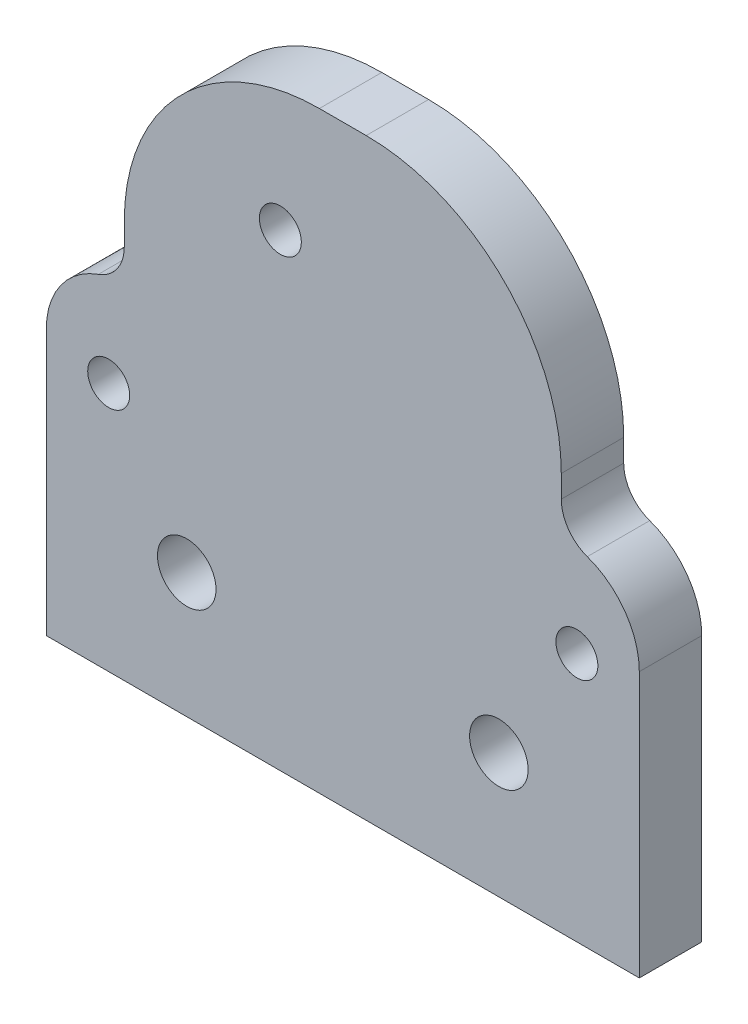
ISO-10303-21;
HEADER;
FILE_DESCRIPTION(('STEP AP214'),'2;1');
FILE_NAME('part.step','',(''),(''),'','','');
FILE_SCHEMA(('AUTOMOTIVE_DESIGN { 1 0 10303 214 1 1 1 1 }'));
ENDSEC;
DATA;
#1=APPLICATION_CONTEXT('core data for automotive mechanical design processes');
#2=APPLICATION_PROTOCOL_DEFINITION('international standard','automotive_design',2000,#1);
#3=PRODUCT_CONTEXT('',#1,'mechanical');
#4=PRODUCT('Part','Part','',(#3));
#5=PRODUCT_RELATED_PRODUCT_CATEGORY('part','',(#4));
#6=PRODUCT_DEFINITION_FORMATION('','',#4);
#7=PRODUCT_DEFINITION_CONTEXT('part definition',#1,'design');
#8=PRODUCT_DEFINITION('design','',#6,#7);
#9=PRODUCT_DEFINITION_SHAPE('','',#8);
#10=(LENGTH_UNIT() NAMED_UNIT(*) SI_UNIT(.MILLI.,.METRE.));
#11=(NAMED_UNIT(*) PLANE_ANGLE_UNIT() SI_UNIT($,.RADIAN.));
#12=(NAMED_UNIT(*) SI_UNIT($,.STERADIAN.) SOLID_ANGLE_UNIT());
#13=UNCERTAINTY_MEASURE_WITH_UNIT(LENGTH_MEASURE(1.E-05),#10,'distance_accuracy_value','');
#14=(GEOMETRIC_REPRESENTATION_CONTEXT(3) GLOBAL_UNCERTAINTY_ASSIGNED_CONTEXT((#13)) GLOBAL_UNIT_ASSIGNED_CONTEXT((#10,
#11,#12)) REPRESENTATION_CONTEXT('',''));
#15=CARTESIAN_POINT('',(0.,0.,0.));
#16=DIRECTION('',(0.,0.,1.));
#17=DIRECTION('',(1.,0.,0.));
#18=AXIS2_PLACEMENT_3D('',#15,#16,#17);
#19=CARTESIAN_POINT('',(0.,17.6,0.));
#20=DIRECTION('',(1.,0.,0.));
#21=DIRECTION('',(0.,0.,-1.));
#22=AXIS2_PLACEMENT_3D('',#19,#20,#21);
#23=PLANE('',#22);
#24=DIRECTION('',(0.,-1.,0.));
#25=VECTOR('',#24,1.);
#26=CARTESIAN_POINT('',(0.,17.6,3.2));
#27=LINE('',#26,#25);
#28=CARTESIAN_POINT('',(0.,13.6,3.2));
#29=VERTEX_POINT('',#28);
#30=CARTESIAN_POINT('',(0.,0.,3.2));
#31=VERTEX_POINT('',#30);
#32=EDGE_CURVE('E120',#29,#31,#27,.T.);
#33=ORIENTED_EDGE('',*,*,#32,.F.);
#34=DIRECTION('',(0.,0.,1.));
#35=VECTOR('',#34,1.);
#36=CARTESIAN_POINT('',(0.,13.6,0.));
#37=LINE('',#36,#35);
#38=CARTESIAN_POINT('',(0.,13.6,0.));
#39=VERTEX_POINT('',#38);
#40=EDGE_CURVE('E195',#29,#39,#37,.F.);
#41=ORIENTED_EDGE('',*,*,#40,.T.);
#42=DIRECTION('',(0.,-1.,0.));
#43=VECTOR('',#42,1.);
#44=CARTESIAN_POINT('',(0.,17.6,0.));
#45=LINE('',#44,#43);
#46=CARTESIAN_POINT('',(0.,0.,0.));
#47=VERTEX_POINT('',#46);
#48=EDGE_CURVE('E142',#39,#47,#45,.T.);
#49=ORIENTED_EDGE('',*,*,#48,.T.);
#50=DIRECTION('',(0.,0.,1.));
#51=VECTOR('',#50,1.);
#52=CARTESIAN_POINT('',(0.,0.,0.));
#53=LINE('',#52,#51);
#54=EDGE_CURVE('E137',#47,#31,#53,.T.);
#55=ORIENTED_EDGE('',*,*,#54,.T.);
#56=EDGE_LOOP('',(#33,#41,#49,#55));
#57=FACE_BOUND('',#56,.T.);
#58=ADVANCED_FACE('F33',(#57),#23,.F.);
#59=CARTESIAN_POINT('',(0.,17.6,3.2));
#60=DIRECTION('',(0.,0.,-1.));
#61=DIRECTION('',(-1.,0.,0.));
#62=AXIS2_PLACEMENT_3D('',#59,#60,#61);
#63=PLANE('',#62);
#64=CARTESIAN_POINT('',(12.,24.,3.2));
#65=DIRECTION('',(0.,0.,1.));
#66=DIRECTION('',(1.,0.,0.));
#67=AXIS2_PLACEMENT_3D('',#64,#65,#66);
#68=CIRCLE('',#67,1.075);
#69=CARTESIAN_POINT('',(13.075,24.,3.2));
#70=VERTEX_POINT('',#69);
#71=EDGE_CURVE('E167',#70,#70,#68,.T.);
#72=ORIENTED_EDGE('',*,*,#71,.F.);
#73=EDGE_LOOP('',(#72));
#74=FACE_BOUND('',#73,.T.);
#75=CARTESIAN_POINT('',(3.2,12.8,3.2));
#76=DIRECTION('',(0.,0.,-1.));
#77=DIRECTION('',(-1.,0.,0.));
#78=AXIS2_PLACEMENT_3D('',#75,#76,#77);
#79=CIRCLE('',#78,1.075);
#80=CARTESIAN_POINT('',(2.125,12.8,3.2));
#81=VERTEX_POINT('',#80);
#82=EDGE_CURVE('E259',#81,#81,#79,.T.);
#83=ORIENTED_EDGE('',*,*,#82,.T.);
#84=EDGE_LOOP('',(#83));
#85=FACE_BOUND('',#84,.T.);
#86=CARTESIAN_POINT('',(27.2,12.8,3.2));
#87=DIRECTION('',(0.,0.,-1.));
#88=DIRECTION('',(-1.,0.,0.));
#89=AXIS2_PLACEMENT_3D('',#86,#87,#88);
#90=CIRCLE('',#89,1.075);
#91=CARTESIAN_POINT('',(26.125,12.8,3.2));
#92=VERTEX_POINT('',#91);
#93=EDGE_CURVE('E265',#92,#92,#90,.T.);
#94=ORIENTED_EDGE('',*,*,#93,.T.);
#95=EDGE_LOOP('',(#94));
#96=FACE_BOUND('',#95,.T.);
#97=CARTESIAN_POINT('',(7.2,6.4,3.2));
#98=DIRECTION('',(0.,0.,1.));
#99=DIRECTION('',(1.,0.,0.));
#100=AXIS2_PLACEMENT_3D('',#97,#98,#99);
#101=CIRCLE('',#100,1.5);
#102=CARTESIAN_POINT('',(8.70000000000001,6.4,3.2));
#103=VERTEX_POINT('',#102);
#104=EDGE_CURVE('E162',#103,#103,#101,.T.);
#105=ORIENTED_EDGE('',*,*,#104,.F.);
#106=EDGE_LOOP('',(#105));
#107=FACE_BOUND('',#106,.T.);
#108=CARTESIAN_POINT('',(23.2,6.4,3.2));
#109=DIRECTION('',(0.,0.,1.));
#110=DIRECTION('',(1.,0.,0.));
#111=AXIS2_PLACEMENT_3D('',#108,#109,#110);
#112=CIRCLE('',#111,1.5);
#113=CARTESIAN_POINT('',(24.7,6.4,3.2));
#114=VERTEX_POINT('',#113);
#115=EDGE_CURVE('E147',#114,#114,#112,.T.);
#116=ORIENTED_EDGE('',*,*,#115,.F.);
#117=EDGE_LOOP('',(#116));
#118=FACE_BOUND('',#117,.T.);
#119=DIRECTION('',(0.,-1.,0.));
#120=VECTOR('',#119,1.);
#121=CARTESIAN_POINT('',(30.4,17.6,3.2));
#122=LINE('',#121,#120);
#123=CARTESIAN_POINT('',(30.4,13.6,3.2));
#124=VERTEX_POINT('',#123);
#125=CARTESIAN_POINT('',(30.4,0.,3.2));
#126=VERTEX_POINT('',#125);
#127=EDGE_CURVE('E131',#124,#126,#122,.T.);
#128=ORIENTED_EDGE('',*,*,#127,.F.);
#129=CARTESIAN_POINT('',(26.4,13.6,3.2));
#130=DIRECTION('',(0.,0.,-1.));
#131=DIRECTION('',(-1.,0.,0.));
#132=AXIS2_PLACEMENT_3D('',#129,#130,#131);
#133=CIRCLE('',#132,4.);
#134=CARTESIAN_POINT('',(27.7333333333333,17.3712361663283,3.2));
#135=VERTEX_POINT('',#134);
#136=EDGE_CURVE('E192',#124,#135,#133,.F.);
#137=ORIENTED_EDGE('',*,*,#136,.T.);
#138=CARTESIAN_POINT('',(28.4,19.2568542494924,3.2));
#139=DIRECTION('',(0.,0.,-1.));
#140=DIRECTION('',(-1.,0.,0.));
#141=AXIS2_PLACEMENT_3D('',#138,#139,#140);
#142=CIRCLE('',#141,2.);
#143=CARTESIAN_POINT('',(26.4,19.2568542494924,3.2));
#144=VERTEX_POINT('',#143);
#145=EDGE_CURVE('E208',#135,#144,#142,.T.);
#146=ORIENTED_EDGE('',*,*,#145,.T.);
#147=DIRECTION('',(0.,-1.,0.));
#148=VECTOR('',#147,1.);
#149=CARTESIAN_POINT('',(26.4,30.4,3.2));
#150=LINE('',#149,#148);
#151=CARTESIAN_POINT('',(26.4,20.4,3.2));
#152=VERTEX_POINT('',#151);
#153=EDGE_CURVE('E212',#152,#144,#150,.T.);
#154=ORIENTED_EDGE('',*,*,#153,.F.);
#155=CARTESIAN_POINT('',(16.4,20.4,3.2));
#156=DIRECTION('',(0.,0.,-1.));
#157=DIRECTION('',(-1.,0.,0.));
#158=AXIS2_PLACEMENT_3D('',#155,#156,#157);
#159=CIRCLE('',#158,10.);
#160=CARTESIAN_POINT('',(16.4,30.4,3.2));
#161=VERTEX_POINT('',#160);
#162=EDGE_CURVE('E173',#152,#161,#159,.F.);
#163=ORIENTED_EDGE('',*,*,#162,.T.);
#164=DIRECTION('',(1.,0.,0.));
#165=VECTOR('',#164,1.);
#166=CARTESIAN_POINT('',(4.,30.4,3.2));
#167=LINE('',#166,#165);
#168=CARTESIAN_POINT('',(14.,30.4,3.2));
#169=VERTEX_POINT('',#168);
#170=EDGE_CURVE('E166',#169,#161,#167,.T.);
#171=ORIENTED_EDGE('',*,*,#170,.F.);
#172=CARTESIAN_POINT('',(14.,20.4,3.2));
#173=DIRECTION('',(0.,0.,-1.));
#174=DIRECTION('',(-1.,0.,0.));
#175=AXIS2_PLACEMENT_3D('',#172,#173,#174);
#176=CIRCLE('',#175,10.);
#177=CARTESIAN_POINT('',(4.,20.4,3.2));
#178=VERTEX_POINT('',#177);
#179=EDGE_CURVE('E175',#169,#178,#176,.F.);
#180=ORIENTED_EDGE('',*,*,#179,.T.);
#181=DIRECTION('',(0.,-1.,0.));
#182=VECTOR('',#181,1.);
#183=CARTESIAN_POINT('',(4.,30.4,3.2));
#184=LINE('',#183,#182);
#185=CARTESIAN_POINT('',(4.,19.2568542494924,3.2));
#186=VERTEX_POINT('',#185);
#187=EDGE_CURVE('E223',#178,#186,#184,.T.);
#188=ORIENTED_EDGE('',*,*,#187,.T.);
#189=CARTESIAN_POINT('',(2.,19.2568542494924,3.2));
#190=DIRECTION('',(0.,0.,-1.));
#191=DIRECTION('',(-1.,0.,0.));
#192=AXIS2_PLACEMENT_3D('',#189,#190,#191);
#193=CIRCLE('',#192,2.);
#194=CARTESIAN_POINT('',(2.66666666666667,17.3712361663283,3.2));
#195=VERTEX_POINT('',#194);
#196=EDGE_CURVE('E41',#186,#195,#193,.T.);
#197=ORIENTED_EDGE('',*,*,#196,.T.);
#198=CARTESIAN_POINT('',(4.,13.6,3.2));
#199=DIRECTION('',(0.,0.,-1.));
#200=DIRECTION('',(-1.,0.,0.));
#201=AXIS2_PLACEMENT_3D('',#198,#199,#200);
#202=CIRCLE('',#201,4.);
#203=EDGE_CURVE('E126',#195,#29,#202,.F.);
#204=ORIENTED_EDGE('',*,*,#203,.T.);
#205=ORIENTED_EDGE('',*,*,#32,.T.);
#206=DIRECTION('',(1.,0.,0.));
#207=VECTOR('',#206,1.);
#208=CARTESIAN_POINT('',(0.,0.,3.2));
#209=LINE('',#208,#207);
#210=EDGE_CURVE('E124',#31,#126,#209,.T.);
#211=ORIENTED_EDGE('',*,*,#210,.T.);
#212=EDGE_LOOP('',(#128,#137,#146,#154,#163,#171,#180,#188,#197,#204,#205,#211));
#213=FACE_BOUND('',#212,.T.);
#214=ADVANCED_FACE('F123',(#74,#85,#96,#107,#118,#213),#63,.F.);
#215=CARTESIAN_POINT('',(30.4,17.6,0.));
#216=DIRECTION('',(-1.,0.,0.));
#217=DIRECTION('',(0.,0.,1.));
#218=AXIS2_PLACEMENT_3D('',#215,#216,#217);
#219=PLANE('',#218);
#220=DIRECTION('',(0.,-1.,0.));
#221=VECTOR('',#220,1.);
#222=CARTESIAN_POINT('',(30.4,17.6,0.));
#223=LINE('',#222,#221);
#224=CARTESIAN_POINT('',(30.4,13.6,0.));
#225=VERTEX_POINT('',#224);
#226=CARTESIAN_POINT('',(30.4,0.,0.));
#227=VERTEX_POINT('',#226);
#228=EDGE_CURVE('E156',#225,#227,#223,.T.);
#229=ORIENTED_EDGE('',*,*,#228,.F.);
#230=DIRECTION('',(0.,0.,-1.));
#231=VECTOR('',#230,1.);
#232=CARTESIAN_POINT('',(30.4,13.6,3.2));
#233=LINE('',#232,#231);
#234=EDGE_CURVE('E189',#225,#124,#233,.F.);
#235=ORIENTED_EDGE('',*,*,#234,.T.);
#236=ORIENTED_EDGE('',*,*,#127,.T.);
#237=DIRECTION('',(0.,0.,-1.));
#238=VECTOR('',#237,1.);
#239=CARTESIAN_POINT('',(30.4,0.,0.));
#240=LINE('',#239,#238);
#241=EDGE_CURVE('E139',#126,#227,#240,.T.);
#242=ORIENTED_EDGE('',*,*,#241,.T.);
#243=EDGE_LOOP('',(#229,#235,#236,#242));
#244=FACE_BOUND('',#243,.T.);
#245=ADVANCED_FACE('F235',(#244),#219,.F.);
#246=CARTESIAN_POINT('',(0.,17.6,0.));
#247=DIRECTION('',(0.,0.,1.));
#248=DIRECTION('',(1.,0.,0.));
#249=AXIS2_PLACEMENT_3D('',#246,#247,#248);
#250=PLANE('',#249);
#251=CARTESIAN_POINT('',(12.,24.,0.));
#252=DIRECTION('',(0.,0.,1.));
#253=DIRECTION('',(1.,0.,0.));
#254=AXIS2_PLACEMENT_3D('',#251,#252,#253);
#255=CIRCLE('',#254,1.075);
#256=CARTESIAN_POINT('',(13.075,24.,0.));
#257=VERTEX_POINT('',#256);
#258=EDGE_CURVE('E163',#257,#257,#255,.T.);
#259=ORIENTED_EDGE('',*,*,#258,.T.);
#260=EDGE_LOOP('',(#259));
#261=FACE_BOUND('',#260,.T.);
#262=CARTESIAN_POINT('',(3.2,12.8,0.));
#263=DIRECTION('',(0.,0.,-1.));
#264=DIRECTION('',(-1.,0.,0.));
#265=AXIS2_PLACEMENT_3D('',#262,#263,#264);
#266=CIRCLE('',#265,1.075);
#267=CARTESIAN_POINT('',(2.125,12.8,0.));
#268=VERTEX_POINT('',#267);
#269=EDGE_CURVE('E256',#268,#268,#266,.T.);
#270=ORIENTED_EDGE('',*,*,#269,.F.);
#271=EDGE_LOOP('',(#270));
#272=FACE_BOUND('',#271,.T.);
#273=CARTESIAN_POINT('',(27.2,12.8,0.));
#274=DIRECTION('',(0.,0.,-1.));
#275=DIRECTION('',(-1.,0.,0.));
#276=AXIS2_PLACEMENT_3D('',#273,#274,#275);
#277=CIRCLE('',#276,1.075);
#278=CARTESIAN_POINT('',(26.125,12.8,0.));
#279=VERTEX_POINT('',#278);
#280=EDGE_CURVE('E262',#279,#279,#277,.T.);
#281=ORIENTED_EDGE('',*,*,#280,.F.);
#282=EDGE_LOOP('',(#281));
#283=FACE_BOUND('',#282,.T.);
#284=CARTESIAN_POINT('',(7.2,6.4,0.));
#285=DIRECTION('',(0.,0.,1.));
#286=DIRECTION('',(1.,0.,0.));
#287=AXIS2_PLACEMENT_3D('',#284,#285,#286);
#288=CIRCLE('',#287,1.5);
#289=CARTESIAN_POINT('',(8.70000000000001,6.4,0.));
#290=VERTEX_POINT('',#289);
#291=EDGE_CURVE('E159',#290,#290,#288,.T.);
#292=ORIENTED_EDGE('',*,*,#291,.T.);
#293=EDGE_LOOP('',(#292));
#294=FACE_BOUND('',#293,.T.);
#295=CARTESIAN_POINT('',(23.2,6.4,0.));
#296=DIRECTION('',(0.,0.,1.));
#297=DIRECTION('',(1.,0.,0.));
#298=AXIS2_PLACEMENT_3D('',#295,#296,#297);
#299=CIRCLE('',#298,1.5);
#300=CARTESIAN_POINT('',(24.7,6.4,0.));
#301=VERTEX_POINT('',#300);
#302=EDGE_CURVE('E144',#301,#301,#299,.T.);
#303=ORIENTED_EDGE('',*,*,#302,.T.);
#304=EDGE_LOOP('',(#303));
#305=FACE_BOUND('',#304,.T.);
#306=DIRECTION('',(0.,-1.,0.));
#307=VECTOR('',#306,1.);
#308=CARTESIAN_POINT('',(26.4,30.4,0.));
#309=LINE('',#308,#307);
#310=CARTESIAN_POINT('',(26.4,20.4,0.));
#311=VERTEX_POINT('',#310);
#312=CARTESIAN_POINT('',(26.4,19.2568542494924,0.));
#313=VERTEX_POINT('',#312);
#314=EDGE_CURVE('E224',#311,#313,#309,.T.);
#315=ORIENTED_EDGE('',*,*,#314,.T.);
#316=CARTESIAN_POINT('',(28.4,19.2568542494924,0.));
#317=DIRECTION('',(0.,0.,1.));
#318=DIRECTION('',(1.,0.,0.));
#319=AXIS2_PLACEMENT_3D('',#316,#317,#318);
#320=CIRCLE('',#319,2.);
#321=CARTESIAN_POINT('',(27.7333333333333,17.3712361663283,0.));
#322=VERTEX_POINT('',#321);
#323=EDGE_CURVE('E206',#313,#322,#320,.T.);
#324=ORIENTED_EDGE('',*,*,#323,.T.);
#325=CARTESIAN_POINT('',(26.4,13.6,0.));
#326=DIRECTION('',(0.,0.,1.));
#327=DIRECTION('',(1.,0.,0.));
#328=AXIS2_PLACEMENT_3D('',#325,#326,#327);
#329=CIRCLE('',#328,4.);
#330=EDGE_CURVE('E187',#322,#225,#329,.F.);
#331=ORIENTED_EDGE('',*,*,#330,.T.);
#332=ORIENTED_EDGE('',*,*,#228,.T.);
#333=DIRECTION('',(-1.,0.,0.));
#334=VECTOR('',#333,1.);
#335=CARTESIAN_POINT('',(0.,0.,0.));
#336=LINE('',#335,#334);
#337=EDGE_CURVE('E153',#227,#47,#336,.T.);
#338=ORIENTED_EDGE('',*,*,#337,.T.);
#339=ORIENTED_EDGE('',*,*,#48,.F.);
#340=CARTESIAN_POINT('',(4.,13.6,0.));
#341=DIRECTION('',(0.,0.,1.));
#342=DIRECTION('',(1.,0.,0.));
#343=AXIS2_PLACEMENT_3D('',#340,#341,#342);
#344=CIRCLE('',#343,4.);
#345=CARTESIAN_POINT('',(2.66666666666667,17.3712361663283,0.));
#346=VERTEX_POINT('',#345);
#347=EDGE_CURVE('E185',#39,#346,#344,.F.);
#348=ORIENTED_EDGE('',*,*,#347,.T.);
#349=CARTESIAN_POINT('',(2.,19.2568542494924,0.));
#350=DIRECTION('',(0.,0.,1.));
#351=DIRECTION('',(1.,0.,0.));
#352=AXIS2_PLACEMENT_3D('',#349,#350,#351);
#353=CIRCLE('',#352,2.);
#354=CARTESIAN_POINT('',(4.,19.2568542494924,0.));
#355=VERTEX_POINT('',#354);
#356=EDGE_CURVE('E11',#346,#355,#353,.T.);
#357=ORIENTED_EDGE('',*,*,#356,.T.);
#358=DIRECTION('',(0.,-1.,0.));
#359=VECTOR('',#358,1.);
#360=CARTESIAN_POINT('',(4.,30.4,0.));
#361=LINE('',#360,#359);
#362=CARTESIAN_POINT('',(4.,20.4,0.));
#363=VERTEX_POINT('',#362);
#364=EDGE_CURVE('E242',#363,#355,#361,.T.);
#365=ORIENTED_EDGE('',*,*,#364,.F.);
#366=CARTESIAN_POINT('',(14.,20.4,0.));
#367=DIRECTION('',(0.,0.,1.));
#368=DIRECTION('',(1.,0.,0.));
#369=AXIS2_PLACEMENT_3D('',#366,#367,#368);
#370=CIRCLE('',#369,10.);
#371=CARTESIAN_POINT('',(14.,30.4,0.));
#372=VERTEX_POINT('',#371);
#373=EDGE_CURVE('E181',#363,#372,#370,.F.);
#374=ORIENTED_EDGE('',*,*,#373,.T.);
#375=DIRECTION('',(-1.,0.,0.));
#376=VECTOR('',#375,1.);
#377=CARTESIAN_POINT('',(4.,30.4,0.));
#378=LINE('',#377,#376);
#379=CARTESIAN_POINT('',(16.4,30.4,0.));
#380=VERTEX_POINT('',#379);
#381=EDGE_CURVE('E248',#380,#372,#378,.T.);
#382=ORIENTED_EDGE('',*,*,#381,.F.);
#383=CARTESIAN_POINT('',(16.4,20.4,0.));
#384=DIRECTION('',(0.,0.,1.));
#385=DIRECTION('',(1.,0.,0.));
#386=AXIS2_PLACEMENT_3D('',#383,#384,#385);
#387=CIRCLE('',#386,10.);
#388=EDGE_CURVE('E179',#380,#311,#387,.F.);
#389=ORIENTED_EDGE('',*,*,#388,.T.);
#390=EDGE_LOOP('',(#315,#324,#331,#332,#338,#339,#348,#357,#365,#374,#382,#389));
#391=FACE_BOUND('',#390,.T.);
#392=ADVANCED_FACE('F229',(#261,#272,#283,#294,#305,#391),#250,.F.);
#393=CARTESIAN_POINT('',(0.,0.,0.));
#394=DIRECTION('',(0.,1.,0.));
#395=DIRECTION('',(0.,0.,1.));
#396=AXIS2_PLACEMENT_3D('',#393,#394,#395);
#397=PLANE('',#396);
#398=ORIENTED_EDGE('',*,*,#54,.F.);
#399=ORIENTED_EDGE('',*,*,#337,.F.);
#400=ORIENTED_EDGE('',*,*,#241,.F.);
#401=ORIENTED_EDGE('',*,*,#210,.F.);
#402=EDGE_LOOP('',(#398,#399,#400,#401));
#403=FACE_BOUND('',#402,.T.);
#404=ADVANCED_FACE('F135',(#403),#397,.F.);
#405=CARTESIAN_POINT('',(23.2,6.4,-12.8));
#406=DIRECTION('',(0.,0.,1.));
#407=DIRECTION('',(1.,0.,0.));
#408=AXIS2_PLACEMENT_3D('',#405,#406,#407);
#409=CYLINDRICAL_SURFACE('',#408,1.5);
#410=ORIENTED_EDGE('',*,*,#115,.T.);
#411=EDGE_LOOP('',(#410));
#412=FACE_BOUND('',#411,.T.);
#413=ORIENTED_EDGE('',*,*,#302,.F.);
#414=EDGE_LOOP('',(#413));
#415=FACE_BOUND('',#414,.T.);
#416=ADVANCED_FACE('F280',(#412,#415),#409,.F.);
#417=CARTESIAN_POINT('',(7.2,6.4,-12.8));
#418=DIRECTION('',(0.,0.,1.));
#419=DIRECTION('',(1.,0.,0.));
#420=AXIS2_PLACEMENT_3D('',#417,#418,#419);
#421=CYLINDRICAL_SURFACE('',#420,1.5);
#422=ORIENTED_EDGE('',*,*,#104,.T.);
#423=EDGE_LOOP('',(#422));
#424=FACE_BOUND('',#423,.T.);
#425=ORIENTED_EDGE('',*,*,#291,.F.);
#426=EDGE_LOOP('',(#425));
#427=FACE_BOUND('',#426,.T.);
#428=ADVANCED_FACE('F270',(#424,#427),#421,.F.);
#429=CARTESIAN_POINT('',(27.2,12.8,16.));
#430=DIRECTION('',(0.,0.,-1.));
#431=DIRECTION('',(-1.,0.,0.));
#432=AXIS2_PLACEMENT_3D('',#429,#430,#431);
#433=CYLINDRICAL_SURFACE('',#432,1.075);
#434=ORIENTED_EDGE('',*,*,#280,.T.);
#435=EDGE_LOOP('',(#434));
#436=FACE_BOUND('',#435,.T.);
#437=ORIENTED_EDGE('',*,*,#93,.F.);
#438=EDGE_LOOP('',(#437));
#439=FACE_BOUND('',#438,.T.);
#440=ADVANCED_FACE('F363',(#436,#439),#433,.F.);
#441=CARTESIAN_POINT('',(3.2,12.8,16.));
#442=DIRECTION('',(0.,0.,-1.));
#443=DIRECTION('',(-1.,0.,0.));
#444=AXIS2_PLACEMENT_3D('',#441,#442,#443);
#445=CYLINDRICAL_SURFACE('',#444,1.075);
#446=ORIENTED_EDGE('',*,*,#269,.T.);
#447=EDGE_LOOP('',(#446));
#448=FACE_BOUND('',#447,.T.);
#449=ORIENTED_EDGE('',*,*,#82,.F.);
#450=EDGE_LOOP('',(#449));
#451=FACE_BOUND('',#450,.T.);
#452=ADVANCED_FACE('F352',(#448,#451),#445,.F.);
#453=CARTESIAN_POINT('',(4.,30.4,3.2));
#454=DIRECTION('',(1.,0.,0.));
#455=DIRECTION('',(0.,0.,-1.));
#456=AXIS2_PLACEMENT_3D('',#453,#454,#455);
#457=PLANE('',#456);
#458=ORIENTED_EDGE('',*,*,#364,.T.);
#459=DIRECTION('',(0.,0.,-1.));
#460=VECTOR('',#459,1.);
#461=CARTESIAN_POINT('',(4.,19.2568542494924,3.2));
#462=LINE('',#461,#460);
#463=EDGE_CURVE('E202',#355,#186,#462,.F.);
#464=ORIENTED_EDGE('',*,*,#463,.T.);
#465=ORIENTED_EDGE('',*,*,#187,.F.);
#466=DIRECTION('',(0.,0.,1.));
#467=VECTOR('',#466,1.);
#468=CARTESIAN_POINT('',(4.,20.4,3.2));
#469=LINE('',#468,#467);
#470=EDGE_CURVE('E177',#178,#363,#469,.F.);
#471=ORIENTED_EDGE('',*,*,#470,.T.);
#472=EDGE_LOOP('',(#458,#464,#465,#471));
#473=FACE_BOUND('',#472,.T.);
#474=ADVANCED_FACE('F245',(#473),#457,.F.);
#475=CARTESIAN_POINT('',(26.4,30.4,3.2));
#476=DIRECTION('',(-1.,0.,0.));
#477=DIRECTION('',(0.,0.,1.));
#478=AXIS2_PLACEMENT_3D('',#475,#476,#477);
#479=PLANE('',#478);
#480=ORIENTED_EDGE('',*,*,#153,.T.);
#481=DIRECTION('',(0.,0.,1.));
#482=VECTOR('',#481,1.);
#483=CARTESIAN_POINT('',(26.4,19.2568542494924,3.2));
#484=LINE('',#483,#482);
#485=EDGE_CURVE('E197',#144,#313,#484,.F.);
#486=ORIENTED_EDGE('',*,*,#485,.T.);
#487=ORIENTED_EDGE('',*,*,#314,.F.);
#488=DIRECTION('',(0.,0.,-1.));
#489=VECTOR('',#488,1.);
#490=CARTESIAN_POINT('',(26.4,20.4,3.2));
#491=LINE('',#490,#489);
#492=EDGE_CURVE('E183',#311,#152,#491,.F.);
#493=ORIENTED_EDGE('',*,*,#492,.T.);
#494=EDGE_LOOP('',(#480,#486,#487,#493));
#495=FACE_BOUND('',#494,.T.);
#496=ADVANCED_FACE('F219',(#495),#479,.F.);
#497=CARTESIAN_POINT('',(0.,30.4,0.));
#498=DIRECTION('',(0.,-1.,0.));
#499=DIRECTION('',(0.,0.,-1.));
#500=AXIS2_PLACEMENT_3D('',#497,#498,#499);
#501=PLANE('',#500);
#502=ORIENTED_EDGE('',*,*,#381,.T.);
#503=DIRECTION('',(0.,0.,1.));
#504=VECTOR('',#503,1.);
#505=CARTESIAN_POINT('',(14.,30.4,0.));
#506=LINE('',#505,#504);
#507=EDGE_CURVE('E170',#372,#169,#506,.T.);
#508=ORIENTED_EDGE('',*,*,#507,.T.);
#509=ORIENTED_EDGE('',*,*,#170,.T.);
#510=DIRECTION('',(0.,0.,-1.));
#511=VECTOR('',#510,1.);
#512=CARTESIAN_POINT('',(16.4,30.4,0.));
#513=LINE('',#512,#511);
#514=EDGE_CURVE('E130',#161,#380,#513,.T.);
#515=ORIENTED_EDGE('',*,*,#514,.T.);
#516=EDGE_LOOP('',(#502,#508,#509,#515));
#517=FACE_BOUND('',#516,.T.);
#518=ADVANCED_FACE('F345',(#517),#501,.F.);
#519=CARTESIAN_POINT('',(12.,24.,-12.8));
#520=DIRECTION('',(0.,0.,1.));
#521=DIRECTION('',(1.,0.,0.));
#522=AXIS2_PLACEMENT_3D('',#519,#520,#521);
#523=CYLINDRICAL_SURFACE('',#522,1.075);
#524=ORIENTED_EDGE('',*,*,#71,.T.);
#525=EDGE_LOOP('',(#524));
#526=FACE_BOUND('',#525,.T.);
#527=ORIENTED_EDGE('',*,*,#258,.F.);
#528=EDGE_LOOP('',(#527));
#529=FACE_BOUND('',#528,.T.);
#530=ADVANCED_FACE('F307',(#526,#529),#523,.F.);
#531=CARTESIAN_POINT('',(14.,20.4,0.));
#532=DIRECTION('',(0.,0.,1.));
#533=DIRECTION('',(1.,0.,0.));
#534=AXIS2_PLACEMENT_3D('',#531,#532,#533);
#535=CYLINDRICAL_SURFACE('',#534,10.);
#536=ORIENTED_EDGE('',*,*,#373,.F.);
#537=ORIENTED_EDGE('',*,*,#470,.F.);
#538=ORIENTED_EDGE('',*,*,#179,.F.);
#539=ORIENTED_EDGE('',*,*,#507,.F.);
#540=EDGE_LOOP('',(#536,#537,#538,#539));
#541=FACE_BOUND('',#540,.T.);
#542=ADVANCED_FACE('F303',(#541),#535,.T.);
#543=CARTESIAN_POINT('',(16.4,20.4,0.));
#544=DIRECTION('',(0.,0.,-1.));
#545=DIRECTION('',(-1.,0.,0.));
#546=AXIS2_PLACEMENT_3D('',#543,#544,#545);
#547=CYLINDRICAL_SURFACE('',#546,10.);
#548=ORIENTED_EDGE('',*,*,#162,.F.);
#549=ORIENTED_EDGE('',*,*,#492,.F.);
#550=ORIENTED_EDGE('',*,*,#388,.F.);
#551=ORIENTED_EDGE('',*,*,#514,.F.);
#552=EDGE_LOOP('',(#548,#549,#550,#551));
#553=FACE_BOUND('',#552,.T.);
#554=ADVANCED_FACE('F306',(#553),#547,.T.);
#555=CARTESIAN_POINT('',(26.4,13.6,0.));
#556=DIRECTION('',(0.,0.,1.));
#557=DIRECTION('',(1.,0.,0.));
#558=AXIS2_PLACEMENT_3D('',#555,#556,#557);
#559=CYLINDRICAL_SURFACE('',#558,4.);
#560=ORIENTED_EDGE('',*,*,#330,.F.);
#561=DIRECTION('',(0.,0.,1.));
#562=VECTOR('',#561,1.);
#563=CARTESIAN_POINT('',(27.7333333333333,17.3712361663283,0.));
#564=LINE('',#563,#562);
#565=EDGE_CURVE('E200',#322,#135,#564,.T.);
#566=ORIENTED_EDGE('',*,*,#565,.T.);
#567=ORIENTED_EDGE('',*,*,#136,.F.);
#568=ORIENTED_EDGE('',*,*,#234,.F.);
#569=EDGE_LOOP('',(#560,#566,#567,#568));
#570=FACE_BOUND('',#569,.T.);
#571=ADVANCED_FACE('F233',(#570),#559,.T.);
#572=CARTESIAN_POINT('',(4.,13.6,0.));
#573=DIRECTION('',(0.,0.,-1.));
#574=DIRECTION('',(-1.,0.,0.));
#575=AXIS2_PLACEMENT_3D('',#572,#573,#574);
#576=CYLINDRICAL_SURFACE('',#575,4.);
#577=ORIENTED_EDGE('',*,*,#203,.F.);
#578=DIRECTION('',(0.,0.,-1.));
#579=VECTOR('',#578,1.);
#580=CARTESIAN_POINT('',(2.66666666666667,17.3712361663283,0.));
#581=LINE('',#580,#579);
#582=EDGE_CURVE('E54',#195,#346,#581,.T.);
#583=ORIENTED_EDGE('',*,*,#582,.T.);
#584=ORIENTED_EDGE('',*,*,#347,.F.);
#585=ORIENTED_EDGE('',*,*,#40,.F.);
#586=EDGE_LOOP('',(#577,#583,#584,#585));
#587=FACE_BOUND('',#586,.T.);
#588=ADVANCED_FACE('F237',(#587),#576,.T.);
#589=CARTESIAN_POINT('',(28.4,19.2568542494924,0.));
#590=DIRECTION('',(0.,0.,1.));
#591=DIRECTION('',(1.,0.,0.));
#592=AXIS2_PLACEMENT_3D('',#589,#590,#591);
#593=CYLINDRICAL_SURFACE('',#592,2.);
#594=ORIENTED_EDGE('',*,*,#145,.F.);
#595=ORIENTED_EDGE('',*,*,#565,.F.);
#596=ORIENTED_EDGE('',*,*,#323,.F.);
#597=ORIENTED_EDGE('',*,*,#485,.F.);
#598=EDGE_LOOP('',(#594,#595,#596,#597));
#599=FACE_BOUND('',#598,.T.);
#600=ADVANCED_FACE('F226',(#599),#593,.F.);
#601=CARTESIAN_POINT('',(2.,19.2568542494924,0.));
#602=DIRECTION('',(0.,0.,-1.));
#603=DIRECTION('',(-1.,0.,0.));
#604=AXIS2_PLACEMENT_3D('',#601,#602,#603);
#605=CYLINDRICAL_SURFACE('',#604,2.);
#606=ORIENTED_EDGE('',*,*,#356,.F.);
#607=ORIENTED_EDGE('',*,*,#582,.F.);
#608=ORIENTED_EDGE('',*,*,#196,.F.);
#609=ORIENTED_EDGE('',*,*,#463,.F.);
#610=EDGE_LOOP('',(#606,#607,#608,#609));
#611=FACE_BOUND('',#610,.T.);
#612=ADVANCED_FACE('F35',(#611),#605,.F.);
#613=CLOSED_SHELL('',(#58,#214,#245,#392,#404,#416,#428,#440,#452,#474,#496,#518,#530,#542,#554,
#571,#588,#600,#612));
#614=MANIFOLD_SOLID_BREP('B2',#613);
#615=ADVANCED_BREP_SHAPE_REPRESENTATION('',(#18,#614),#14);
#616=SHAPE_DEFINITION_REPRESENTATION(#9,#615);
ENDSEC;
END-ISO-10303-21;
